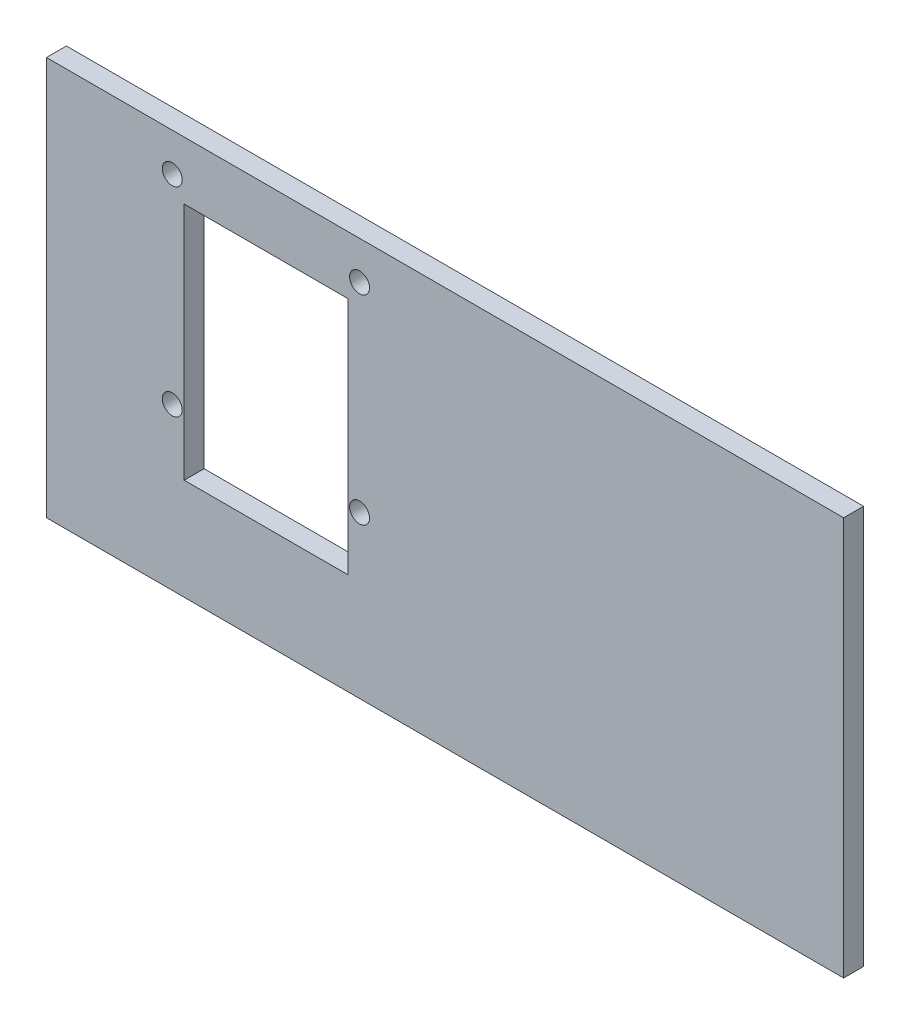
ISO-10303-21;
HEADER;
FILE_DESCRIPTION(('STEP AP214'),'2;1');
FILE_NAME('part.step','',(''),(''),'','','');
FILE_SCHEMA(('AUTOMOTIVE_DESIGN { 1 0 10303 214 1 1 1 1 }'));
ENDSEC;
DATA;
#1=APPLICATION_CONTEXT('core data for automotive mechanical design processes');
#2=APPLICATION_PROTOCOL_DEFINITION('international standard','automotive_design',2000,#1);
#3=PRODUCT_CONTEXT('',#1,'mechanical');
#4=PRODUCT('Part','Part','',(#3));
#5=PRODUCT_RELATED_PRODUCT_CATEGORY('part','',(#4));
#6=PRODUCT_DEFINITION_FORMATION('','',#4);
#7=PRODUCT_DEFINITION_CONTEXT('part definition',#1,'design');
#8=PRODUCT_DEFINITION('design','',#6,#7);
#9=PRODUCT_DEFINITION_SHAPE('','',#8);
#10=(LENGTH_UNIT() NAMED_UNIT(*) SI_UNIT(.MILLI.,.METRE.));
#11=(NAMED_UNIT(*) PLANE_ANGLE_UNIT() SI_UNIT($,.RADIAN.));
#12=(NAMED_UNIT(*) SI_UNIT($,.STERADIAN.) SOLID_ANGLE_UNIT());
#13=UNCERTAINTY_MEASURE_WITH_UNIT(LENGTH_MEASURE(1.E-05),#10,'distance_accuracy_value','');
#14=(GEOMETRIC_REPRESENTATION_CONTEXT(3) GLOBAL_UNCERTAINTY_ASSIGNED_CONTEXT((#13)) GLOBAL_UNIT_ASSIGNED_CONTEXT((#10,
#11,#12)) REPRESENTATION_CONTEXT('',''));
#15=CARTESIAN_POINT('',(0.,0.,0.));
#16=DIRECTION('',(0.,0.,1.));
#17=DIRECTION('',(1.,0.,0.));
#18=AXIS2_PLACEMENT_3D('',#15,#16,#17);
#19=CARTESIAN_POINT('',(0.,0.,6.35));
#20=DIRECTION('',(0.,0.,-1.));
#21=DIRECTION('',(-1.,0.,0.));
#22=AXIS2_PLACEMENT_3D('',#19,#20,#21);
#23=PLANE('',#22);
#24=CARTESIAN_POINT('',(40.0799999999999,114.85,6.35));
#25=DIRECTION('',(0.,0.,1.));
#26=DIRECTION('',(1.,0.,0.));
#27=AXIS2_PLACEMENT_3D('',#24,#25,#26);
#28=CIRCLE('',#27,3.17500000000004);
#29=CARTESIAN_POINT('',(43.255,114.85,6.35));
#30=VERTEX_POINT('',#29);
#31=EDGE_CURVE('E253',#30,#30,#28,.T.);
#32=ORIENTED_EDGE('',*,*,#31,.F.);
#33=EDGE_LOOP('',(#32));
#34=FACE_BOUND('',#33,.T.);
#35=CARTESIAN_POINT('',(99.77,114.85,6.35));
#36=DIRECTION('',(0.,0.,1.));
#37=DIRECTION('',(1.,0.,0.));
#38=AXIS2_PLACEMENT_3D('',#35,#36,#37);
#39=CIRCLE('',#38,3.17499999999998);
#40=CARTESIAN_POINT('',(102.945,114.85,6.35));
#41=VERTEX_POINT('',#40);
#42=EDGE_CURVE('E247',#41,#41,#39,.T.);
#43=ORIENTED_EDGE('',*,*,#42,.F.);
#44=EDGE_LOOP('',(#43));
#45=FACE_BOUND('',#44,.T.);
#46=CARTESIAN_POINT('',(40.0799999999999,51.35,6.35));
#47=DIRECTION('',(0.,0.,1.));
#48=DIRECTION('',(1.,0.,0.));
#49=AXIS2_PLACEMENT_3D('',#46,#47,#48);
#50=CIRCLE('',#49,3.17500000000004);
#51=CARTESIAN_POINT('',(43.255,51.35,6.35));
#52=VERTEX_POINT('',#51);
#53=EDGE_CURVE('E239',#52,#52,#50,.T.);
#54=ORIENTED_EDGE('',*,*,#53,.F.);
#55=EDGE_LOOP('',(#54));
#56=FACE_BOUND('',#55,.T.);
#57=CARTESIAN_POINT('',(99.77,51.35,6.35));
#58=DIRECTION('',(0.,0.,1.));
#59=DIRECTION('',(1.,0.,0.));
#60=AXIS2_PLACEMENT_3D('',#57,#58,#59);
#61=CIRCLE('',#60,3.17499999999998);
#62=CARTESIAN_POINT('',(102.945,51.35,6.35));
#63=VERTEX_POINT('',#62);
#64=EDGE_CURVE('E123',#63,#63,#61,.T.);
#65=ORIENTED_EDGE('',*,*,#64,.F.);
#66=EDGE_LOOP('',(#65));
#67=FACE_BOUND('',#66,.T.);
#68=DIRECTION('',(0.,-1.,0.));
#69=VECTOR('',#68,1.);
#70=CARTESIAN_POINT('',(0.,0.,6.35));
#71=LINE('',#70,#69);
#72=CARTESIAN_POINT('',(0.,127.,6.35));
#73=VERTEX_POINT('',#72);
#74=CARTESIAN_POINT('',(0.,0.,6.35));
#75=VERTEX_POINT('',#74);
#76=EDGE_CURVE('E140',#73,#75,#71,.T.);
#77=ORIENTED_EDGE('',*,*,#76,.T.);
#78=DIRECTION('',(1.,0.,0.));
#79=VECTOR('',#78,1.);
#80=CARTESIAN_POINT('',(0.,0.,6.35));
#81=LINE('',#80,#79);
#82=CARTESIAN_POINT('',(254.,0.,6.35));
#83=VERTEX_POINT('',#82);
#84=EDGE_CURVE('E143',#75,#83,#81,.T.);
#85=ORIENTED_EDGE('',*,*,#84,.T.);
#86=DIRECTION('',(0.,1.,0.));
#87=VECTOR('',#86,1.);
#88=CARTESIAN_POINT('',(254.,0.,6.35));
#89=LINE('',#88,#87);
#90=CARTESIAN_POINT('',(254.,127.,6.35));
#91=VERTEX_POINT('',#90);
#92=EDGE_CURVE('E146',#83,#91,#89,.T.);
#93=ORIENTED_EDGE('',*,*,#92,.T.);
#94=DIRECTION('',(-1.,0.,0.));
#95=VECTOR('',#94,1.);
#96=CARTESIAN_POINT('',(0.,127.,6.35));
#97=LINE('',#96,#95);
#98=EDGE_CURVE('E148',#91,#73,#97,.T.);
#99=ORIENTED_EDGE('',*,*,#98,.T.);
#100=EDGE_LOOP('',(#77,#85,#93,#99));
#101=FACE_BOUND('',#100,.T.);
#102=DIRECTION('',(0.,1.,0.));
#103=VECTOR('',#102,1.);
#104=CARTESIAN_POINT('',(43.89,0.,6.35));
#105=LINE('',#104,#103);
#106=CARTESIAN_POINT('',(43.89,32.3,6.35));
#107=VERTEX_POINT('',#106);
#108=CARTESIAN_POINT('',(43.89,108.5,6.35));
#109=VERTEX_POINT('',#108);
#110=EDGE_CURVE('E50',#107,#109,#105,.T.);
#111=ORIENTED_EDGE('',*,*,#110,.T.);
#112=DIRECTION('',(-1.,0.,0.));
#113=VECTOR('',#112,1.);
#114=CARTESIAN_POINT('',(0.,108.5,6.35));
#115=LINE('',#114,#113);
#116=CARTESIAN_POINT('',(96.1067207226721,108.5,6.35));
#117=VERTEX_POINT('',#116);
#118=EDGE_CURVE('E117',#117,#109,#115,.T.);
#119=ORIENTED_EDGE('',*,*,#118,.F.);
#120=DIRECTION('',(0.,1.,0.));
#121=VECTOR('',#120,1.);
#122=CARTESIAN_POINT('',(96.1067207226721,0.,6.35));
#123=LINE('',#122,#121);
#124=CARTESIAN_POINT('',(96.1067207226721,32.3,6.35));
#125=VERTEX_POINT('',#124);
#126=EDGE_CURVE('E120',#125,#117,#123,.T.);
#127=ORIENTED_EDGE('',*,*,#126,.F.);
#128=DIRECTION('',(-1.,0.,0.));
#129=VECTOR('',#128,1.);
#130=CARTESIAN_POINT('',(0.,32.3,6.35));
#131=LINE('',#130,#129);
#132=EDGE_CURVE('E129',#125,#107,#131,.T.);
#133=ORIENTED_EDGE('',*,*,#132,.T.);
#134=EDGE_LOOP('',(#111,#119,#127,#133));
#135=FACE_BOUND('',#134,.T.);
#136=ADVANCED_FACE('F35',(#34,#45,#56,#67,#101,#135),#23,.F.);
#137=CARTESIAN_POINT('',(0.,0.,0.));
#138=DIRECTION('',(0.,0.,-1.));
#139=DIRECTION('',(-1.,0.,0.));
#140=AXIS2_PLACEMENT_3D('',#137,#138,#139);
#141=PLANE('',#140);
#142=CARTESIAN_POINT('',(40.0799999999999,114.85,0.));
#143=DIRECTION('',(0.,0.,1.));
#144=DIRECTION('',(1.,0.,0.));
#145=AXIS2_PLACEMENT_3D('',#142,#143,#144);
#146=CIRCLE('',#145,3.17500000000004);
#147=CARTESIAN_POINT('',(43.255,114.85,0.));
#148=VERTEX_POINT('',#147);
#149=EDGE_CURVE('E250',#148,#148,#146,.T.);
#150=ORIENTED_EDGE('',*,*,#149,.T.);
#151=EDGE_LOOP('',(#150));
#152=FACE_BOUND('',#151,.T.);
#153=CARTESIAN_POINT('',(99.77,114.85,0.));
#154=DIRECTION('',(0.,0.,1.));
#155=DIRECTION('',(1.,0.,0.));
#156=AXIS2_PLACEMENT_3D('',#153,#154,#155);
#157=CIRCLE('',#156,3.17499999999998);
#158=CARTESIAN_POINT('',(102.945,114.85,0.));
#159=VERTEX_POINT('',#158);
#160=EDGE_CURVE('E244',#159,#159,#157,.T.);
#161=ORIENTED_EDGE('',*,*,#160,.T.);
#162=EDGE_LOOP('',(#161));
#163=FACE_BOUND('',#162,.T.);
#164=CARTESIAN_POINT('',(40.0799999999999,51.35,0.));
#165=DIRECTION('',(0.,0.,1.));
#166=DIRECTION('',(1.,0.,0.));
#167=AXIS2_PLACEMENT_3D('',#164,#165,#166);
#168=CIRCLE('',#167,3.17500000000004);
#169=CARTESIAN_POINT('',(43.255,51.35,0.));
#170=VERTEX_POINT('',#169);
#171=EDGE_CURVE('E237',#170,#170,#168,.T.);
#172=ORIENTED_EDGE('',*,*,#171,.T.);
#173=EDGE_LOOP('',(#172));
#174=FACE_BOUND('',#173,.T.);
#175=CARTESIAN_POINT('',(99.77,51.35,0.));
#176=DIRECTION('',(0.,0.,1.));
#177=DIRECTION('',(1.,0.,0.));
#178=AXIS2_PLACEMENT_3D('',#175,#176,#177);
#179=CIRCLE('',#178,3.17499999999998);
#180=CARTESIAN_POINT('',(102.945,51.35,0.));
#181=VERTEX_POINT('',#180);
#182=EDGE_CURVE('E130',#181,#181,#179,.T.);
#183=ORIENTED_EDGE('',*,*,#182,.T.);
#184=EDGE_LOOP('',(#183));
#185=FACE_BOUND('',#184,.T.);
#186=DIRECTION('',(0.,-1.,0.));
#187=VECTOR('',#186,1.);
#188=CARTESIAN_POINT('',(0.,0.,0.));
#189=LINE('',#188,#187);
#190=CARTESIAN_POINT('',(0.,127.,0.));
#191=VERTEX_POINT('',#190);
#192=CARTESIAN_POINT('',(0.,0.,0.));
#193=VERTEX_POINT('',#192);
#194=EDGE_CURVE('E136',#191,#193,#189,.T.);
#195=ORIENTED_EDGE('',*,*,#194,.F.);
#196=DIRECTION('',(-1.,0.,0.));
#197=VECTOR('',#196,1.);
#198=CARTESIAN_POINT('',(0.,127.,0.));
#199=LINE('',#198,#197);
#200=CARTESIAN_POINT('',(254.,127.,0.));
#201=VERTEX_POINT('',#200);
#202=EDGE_CURVE('E144',#201,#191,#199,.T.);
#203=ORIENTED_EDGE('',*,*,#202,.F.);
#204=DIRECTION('',(0.,1.,0.));
#205=VECTOR('',#204,1.);
#206=CARTESIAN_POINT('',(254.,0.,0.));
#207=LINE('',#206,#205);
#208=CARTESIAN_POINT('',(254.,0.,0.));
#209=VERTEX_POINT('',#208);
#210=EDGE_CURVE('E155',#209,#201,#207,.T.);
#211=ORIENTED_EDGE('',*,*,#210,.F.);
#212=DIRECTION('',(1.,0.,0.));
#213=VECTOR('',#212,1.);
#214=CARTESIAN_POINT('',(0.,0.,0.));
#215=LINE('',#214,#213);
#216=EDGE_CURVE('E153',#193,#209,#215,.T.);
#217=ORIENTED_EDGE('',*,*,#216,.F.);
#218=EDGE_LOOP('',(#195,#203,#211,#217));
#219=FACE_BOUND('',#218,.T.);
#220=DIRECTION('',(-1.,0.,0.));
#221=VECTOR('',#220,1.);
#222=CARTESIAN_POINT('',(0.,108.5,0.));
#223=LINE('',#222,#221);
#224=CARTESIAN_POINT('',(96.1067207226721,108.5,0.));
#225=VERTEX_POINT('',#224);
#226=CARTESIAN_POINT('',(43.89,108.5,0.));
#227=VERTEX_POINT('',#226);
#228=EDGE_CURVE('E112',#225,#227,#223,.T.);
#229=ORIENTED_EDGE('',*,*,#228,.T.);
#230=DIRECTION('',(0.,1.,0.));
#231=VECTOR('',#230,1.);
#232=CARTESIAN_POINT('',(43.89,0.,0.));
#233=LINE('',#232,#231);
#234=CARTESIAN_POINT('',(43.89,32.3,0.));
#235=VERTEX_POINT('',#234);
#236=EDGE_CURVE('E108',#235,#227,#233,.T.);
#237=ORIENTED_EDGE('',*,*,#236,.F.);
#238=DIRECTION('',(-1.,0.,0.));
#239=VECTOR('',#238,1.);
#240=CARTESIAN_POINT('',(0.,32.3,0.));
#241=LINE('',#240,#239);
#242=CARTESIAN_POINT('',(96.1067207226721,32.3,0.));
#243=VERTEX_POINT('',#242);
#244=EDGE_CURVE('E100',#243,#235,#241,.T.);
#245=ORIENTED_EDGE('',*,*,#244,.F.);
#246=DIRECTION('',(0.,1.,0.));
#247=VECTOR('',#246,1.);
#248=CARTESIAN_POINT('',(96.1067207226721,0.,0.));
#249=LINE('',#248,#247);
#250=EDGE_CURVE('E58',#243,#225,#249,.T.);
#251=ORIENTED_EDGE('',*,*,#250,.T.);
#252=EDGE_LOOP('',(#229,#237,#245,#251));
#253=FACE_BOUND('',#252,.T.);
#254=ADVANCED_FACE('F115',(#152,#163,#174,#185,#219,#253),#141,.T.);
#255=CARTESIAN_POINT('',(0.,0.,6.35));
#256=DIRECTION('',(1.,0.,0.));
#257=DIRECTION('',(0.,0.,-1.));
#258=AXIS2_PLACEMENT_3D('',#255,#256,#257);
#259=PLANE('',#258);
#260=ORIENTED_EDGE('',*,*,#194,.T.);
#261=DIRECTION('',(0.,0.,-1.));
#262=VECTOR('',#261,1.);
#263=CARTESIAN_POINT('',(0.,0.,6.35));
#264=LINE('',#263,#262);
#265=EDGE_CURVE('E11',#75,#193,#264,.T.);
#266=ORIENTED_EDGE('',*,*,#265,.F.);
#267=ORIENTED_EDGE('',*,*,#76,.F.);
#268=DIRECTION('',(0.,0.,-1.));
#269=VECTOR('',#268,1.);
#270=CARTESIAN_POINT('',(0.,127.,6.35));
#271=LINE('',#270,#269);
#272=EDGE_CURVE('E150',#73,#191,#271,.T.);
#273=ORIENTED_EDGE('',*,*,#272,.T.);
#274=EDGE_LOOP('',(#260,#266,#267,#273));
#275=FACE_BOUND('',#274,.T.);
#276=ADVANCED_FACE('F37',(#275),#259,.F.);
#277=CARTESIAN_POINT('',(0.,0.,6.35));
#278=DIRECTION('',(0.,1.,0.));
#279=DIRECTION('',(0.,0.,1.));
#280=AXIS2_PLACEMENT_3D('',#277,#278,#279);
#281=PLANE('',#280);
#282=ORIENTED_EDGE('',*,*,#216,.T.);
#283=DIRECTION('',(0.,0.,-1.));
#284=VECTOR('',#283,1.);
#285=CARTESIAN_POINT('',(254.,0.,6.35));
#286=LINE('',#285,#284);
#287=EDGE_CURVE('E43',#83,#209,#286,.T.);
#288=ORIENTED_EDGE('',*,*,#287,.F.);
#289=ORIENTED_EDGE('',*,*,#84,.F.);
#290=ORIENTED_EDGE('',*,*,#265,.T.);
#291=EDGE_LOOP('',(#282,#288,#289,#290));
#292=FACE_BOUND('',#291,.T.);
#293=ADVANCED_FACE('F182',(#292),#281,.F.);
#294=CARTESIAN_POINT('',(254.,0.,6.35));
#295=DIRECTION('',(-1.,0.,0.));
#296=DIRECTION('',(0.,0.,1.));
#297=AXIS2_PLACEMENT_3D('',#294,#295,#296);
#298=PLANE('',#297);
#299=ORIENTED_EDGE('',*,*,#210,.T.);
#300=DIRECTION('',(0.,0.,-1.));
#301=VECTOR('',#300,1.);
#302=CARTESIAN_POINT('',(254.,127.,6.35));
#303=LINE('',#302,#301);
#304=EDGE_CURVE('E160',#91,#201,#303,.T.);
#305=ORIENTED_EDGE('',*,*,#304,.F.);
#306=ORIENTED_EDGE('',*,*,#92,.F.);
#307=ORIENTED_EDGE('',*,*,#287,.T.);
#308=EDGE_LOOP('',(#299,#305,#306,#307));
#309=FACE_BOUND('',#308,.T.);
#310=ADVANCED_FACE('F167',(#309),#298,.F.);
#311=CARTESIAN_POINT('',(0.,127.,6.35));
#312=DIRECTION('',(0.,-1.,0.));
#313=DIRECTION('',(0.,0.,-1.));
#314=AXIS2_PLACEMENT_3D('',#311,#312,#313);
#315=PLANE('',#314);
#316=ORIENTED_EDGE('',*,*,#202,.T.);
#317=ORIENTED_EDGE('',*,*,#272,.F.);
#318=ORIENTED_EDGE('',*,*,#98,.F.);
#319=ORIENTED_EDGE('',*,*,#304,.T.);
#320=EDGE_LOOP('',(#316,#317,#318,#319));
#321=FACE_BOUND('',#320,.T.);
#322=ADVANCED_FACE('F175',(#321),#315,.F.);
#323=CARTESIAN_POINT('',(43.89,0.,0.));
#324=DIRECTION('',(1.,0.,0.));
#325=DIRECTION('',(0.,0.,-1.));
#326=AXIS2_PLACEMENT_3D('',#323,#324,#325);
#327=PLANE('',#326);
#328=ORIENTED_EDGE('',*,*,#110,.F.);
#329=DIRECTION('',(0.,0.,1.));
#330=VECTOR('',#329,1.);
#331=CARTESIAN_POINT('',(43.89,32.3,0.));
#332=LINE('',#331,#330);
#333=EDGE_CURVE('E103',#235,#107,#332,.T.);
#334=ORIENTED_EDGE('',*,*,#333,.F.);
#335=ORIENTED_EDGE('',*,*,#236,.T.);
#336=DIRECTION('',(0.,0.,1.));
#337=VECTOR('',#336,1.);
#338=CARTESIAN_POINT('',(43.89,108.5,0.));
#339=LINE('',#338,#337);
#340=EDGE_CURVE('E134',#227,#109,#339,.T.);
#341=ORIENTED_EDGE('',*,*,#340,.T.);
#342=EDGE_LOOP('',(#328,#334,#335,#341));
#343=FACE_BOUND('',#342,.T.);
#344=ADVANCED_FACE('F110',(#343),#327,.T.);
#345=CARTESIAN_POINT('',(0.,108.5,0.));
#346=DIRECTION('',(0.,1.,0.));
#347=DIRECTION('',(0.,0.,1.));
#348=AXIS2_PLACEMENT_3D('',#345,#346,#347);
#349=PLANE('',#348);
#350=ORIENTED_EDGE('',*,*,#118,.T.);
#351=ORIENTED_EDGE('',*,*,#340,.F.);
#352=ORIENTED_EDGE('',*,*,#228,.F.);
#353=DIRECTION('',(0.,0.,1.));
#354=VECTOR('',#353,1.);
#355=CARTESIAN_POINT('',(96.1067207226721,108.5,0.));
#356=LINE('',#355,#354);
#357=EDGE_CURVE('E137',#225,#117,#356,.T.);
#358=ORIENTED_EDGE('',*,*,#357,.T.);
#359=EDGE_LOOP('',(#350,#351,#352,#358));
#360=FACE_BOUND('',#359,.T.);
#361=ADVANCED_FACE('F206',(#360),#349,.F.);
#362=CARTESIAN_POINT('',(96.1067207226721,0.,0.));
#363=DIRECTION('',(1.,0.,0.));
#364=DIRECTION('',(0.,0.,-1.));
#365=AXIS2_PLACEMENT_3D('',#362,#363,#364);
#366=PLANE('',#365);
#367=ORIENTED_EDGE('',*,*,#126,.T.);
#368=ORIENTED_EDGE('',*,*,#357,.F.);
#369=ORIENTED_EDGE('',*,*,#250,.F.);
#370=DIRECTION('',(0.,0.,1.));
#371=VECTOR('',#370,1.);
#372=CARTESIAN_POINT('',(96.1067207226721,32.3,0.));
#373=LINE('',#372,#371);
#374=EDGE_CURVE('E105',#243,#125,#373,.T.);
#375=ORIENTED_EDGE('',*,*,#374,.T.);
#376=EDGE_LOOP('',(#367,#368,#369,#375));
#377=FACE_BOUND('',#376,.T.);
#378=ADVANCED_FACE('F210',(#377),#366,.F.);
#379=CARTESIAN_POINT('',(0.,32.3,0.));
#380=DIRECTION('',(0.,1.,0.));
#381=DIRECTION('',(-1.,0.,0.));
#382=AXIS2_PLACEMENT_3D('',#379,#380,#381);
#383=PLANE('',#382);
#384=ORIENTED_EDGE('',*,*,#132,.F.);
#385=ORIENTED_EDGE('',*,*,#374,.F.);
#386=ORIENTED_EDGE('',*,*,#244,.T.);
#387=ORIENTED_EDGE('',*,*,#333,.T.);
#388=EDGE_LOOP('',(#384,#385,#386,#387));
#389=FACE_BOUND('',#388,.T.);
#390=ADVANCED_FACE('F102',(#389),#383,.T.);
#391=CARTESIAN_POINT('',(99.77,51.35,0.));
#392=DIRECTION('',(0.,0.,1.));
#393=DIRECTION('',(1.,0.,0.));
#394=AXIS2_PLACEMENT_3D('',#391,#392,#393);
#395=CYLINDRICAL_SURFACE('',#394,3.17499999999998);
#396=ORIENTED_EDGE('',*,*,#182,.F.);
#397=EDGE_LOOP('',(#396));
#398=FACE_BOUND('',#397,.T.);
#399=ORIENTED_EDGE('',*,*,#64,.T.);
#400=EDGE_LOOP('',(#399));
#401=FACE_BOUND('',#400,.T.);
#402=ADVANCED_FACE('F218',(#398,#401),#395,.F.);
#403=CARTESIAN_POINT('',(40.0799999999999,51.35,0.));
#404=DIRECTION('',(0.,0.,1.));
#405=DIRECTION('',(1.,0.,0.));
#406=AXIS2_PLACEMENT_3D('',#403,#404,#405);
#407=CYLINDRICAL_SURFACE('',#406,3.17500000000004);
#408=ORIENTED_EDGE('',*,*,#171,.F.);
#409=EDGE_LOOP('',(#408));
#410=FACE_BOUND('',#409,.T.);
#411=ORIENTED_EDGE('',*,*,#53,.T.);
#412=EDGE_LOOP('',(#411));
#413=FACE_BOUND('',#412,.T.);
#414=ADVANCED_FACE('F224',(#410,#413),#407,.F.);
#415=CARTESIAN_POINT('',(99.77,114.85,0.));
#416=DIRECTION('',(0.,0.,1.));
#417=DIRECTION('',(1.,0.,0.));
#418=AXIS2_PLACEMENT_3D('',#415,#416,#417);
#419=CYLINDRICAL_SURFACE('',#418,3.17499999999998);
#420=ORIENTED_EDGE('',*,*,#160,.F.);
#421=EDGE_LOOP('',(#420));
#422=FACE_BOUND('',#421,.T.);
#423=ORIENTED_EDGE('',*,*,#42,.T.);
#424=EDGE_LOOP('',(#423));
#425=FACE_BOUND('',#424,.T.);
#426=ADVANCED_FACE('F229',(#422,#425),#419,.F.);
#427=CARTESIAN_POINT('',(40.0799999999999,114.85,0.));
#428=DIRECTION('',(0.,0.,1.));
#429=DIRECTION('',(1.,0.,0.));
#430=AXIS2_PLACEMENT_3D('',#427,#428,#429);
#431=CYLINDRICAL_SURFACE('',#430,3.17500000000004);
#432=ORIENTED_EDGE('',*,*,#149,.F.);
#433=EDGE_LOOP('',(#432));
#434=FACE_BOUND('',#433,.T.);
#435=ORIENTED_EDGE('',*,*,#31,.T.);
#436=EDGE_LOOP('',(#435));
#437=FACE_BOUND('',#436,.T.);
#438=ADVANCED_FACE('F260',(#434,#437),#431,.F.);
#439=CLOSED_SHELL('',(#136,#254,#276,#293,#310,#322,#344,#361,#378,#390,#402,#414,#426,#438));
#440=MANIFOLD_SOLID_BREP('B2',#439);
#441=ADVANCED_BREP_SHAPE_REPRESENTATION('',(#18,#440),#14);
#442=SHAPE_DEFINITION_REPRESENTATION(#9,#441);
ENDSEC;
END-ISO-10303-21;
